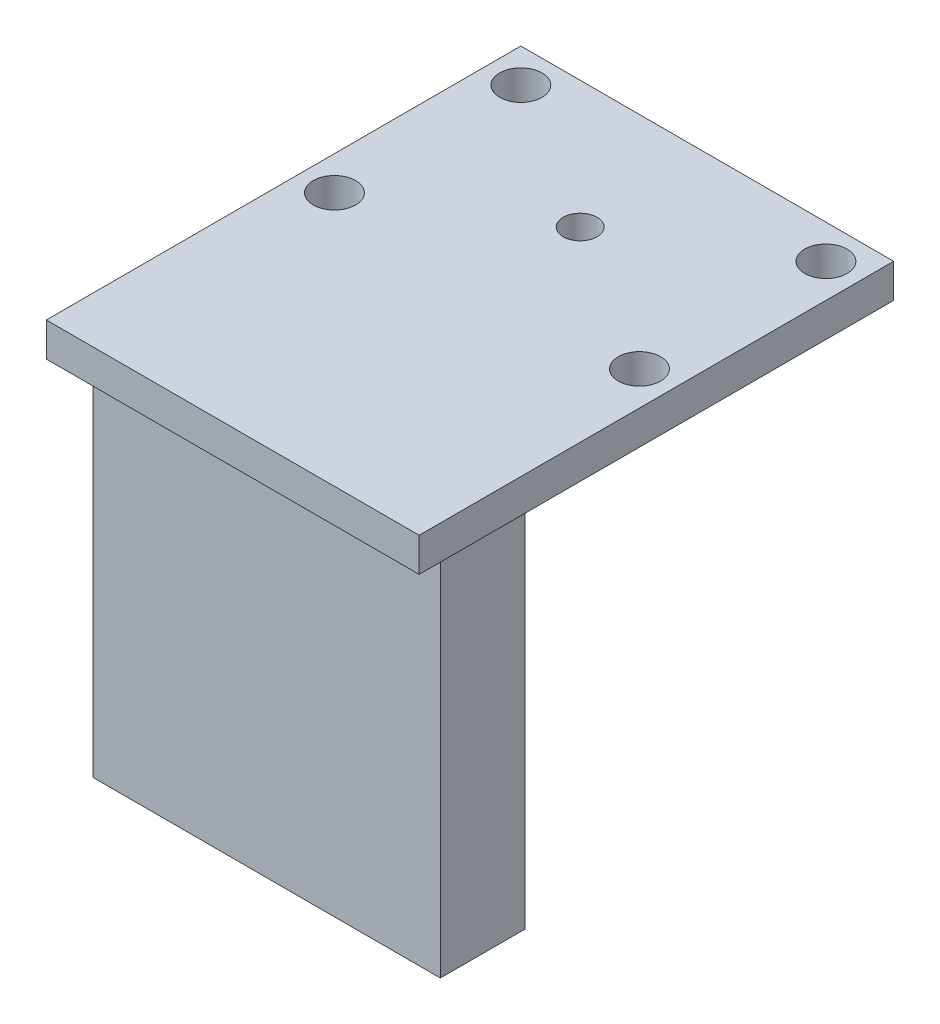
ISO-10303-21;
HEADER;
FILE_DESCRIPTION(('STEP AP214'),'2;1');
FILE_NAME('part.step','',(''),(''),'','','');
FILE_SCHEMA(('AUTOMOTIVE_DESIGN { 1 0 10303 214 1 1 1 1 }'));
ENDSEC;
DATA;
#1=APPLICATION_CONTEXT('core data for automotive mechanical design processes');
#2=APPLICATION_PROTOCOL_DEFINITION('international standard','automotive_design',2000,#1);
#3=PRODUCT_CONTEXT('',#1,'mechanical');
#4=PRODUCT('Part','Part','',(#3));
#5=PRODUCT_RELATED_PRODUCT_CATEGORY('part','',(#4));
#6=PRODUCT_DEFINITION_FORMATION('','',#4);
#7=PRODUCT_DEFINITION_CONTEXT('part definition',#1,'design');
#8=PRODUCT_DEFINITION('design','',#6,#7);
#9=PRODUCT_DEFINITION_SHAPE('','',#8);
#10=(LENGTH_UNIT() NAMED_UNIT(*) SI_UNIT(.MILLI.,.METRE.));
#11=(NAMED_UNIT(*) PLANE_ANGLE_UNIT() SI_UNIT($,.RADIAN.));
#12=(NAMED_UNIT(*) SI_UNIT($,.STERADIAN.) SOLID_ANGLE_UNIT());
#13=UNCERTAINTY_MEASURE_WITH_UNIT(LENGTH_MEASURE(1.E-05),#10,'distance_accuracy_value','');
#14=(GEOMETRIC_REPRESENTATION_CONTEXT(3) GLOBAL_UNCERTAINTY_ASSIGNED_CONTEXT((#13)) GLOBAL_UNIT_ASSIGNED_CONTEXT((#10,
#11,#12)) REPRESENTATION_CONTEXT('',''));
#15=CARTESIAN_POINT('',(0.,0.,0.));
#16=DIRECTION('',(0.,0.,1.));
#17=DIRECTION('',(1.,0.,0.));
#18=AXIS2_PLACEMENT_3D('',#15,#16,#17);
#19=CARTESIAN_POINT('',(0.,0.,0.));
#20=DIRECTION('',(0.,-1.,0.));
#21=DIRECTION('',(0.,0.,-1.));
#22=AXIS2_PLACEMENT_3D('',#19,#20,#21);
#23=PLANE('',#22);
#24=CARTESIAN_POINT('',(0.,0.,-6.5));
#25=DIRECTION('',(0.,-1.,0.));
#26=DIRECTION('',(0.,0.,-1.));
#27=AXIS2_PLACEMENT_3D('',#24,#25,#26);
#28=CIRCLE('',#27,1.);
#29=CARTESIAN_POINT('',(0.,0.,-7.5));
#30=VERTEX_POINT('',#29);
#31=EDGE_CURVE('E251',#30,#30,#28,.F.);
#32=ORIENTED_EDGE('',*,*,#31,.T.);
#33=EDGE_LOOP('',(#32));
#34=FACE_BOUND('',#33,.T.);
#35=CARTESIAN_POINT('',(-9.00000000000015,0.,-12.));
#36=DIRECTION('',(0.,-1.,0.));
#37=DIRECTION('',(0.,0.,-1.));
#38=AXIS2_PLACEMENT_3D('',#35,#36,#37);
#39=CIRCLE('',#38,1.25);
#40=CARTESIAN_POINT('',(-9.00000000000015,0.,-13.25));
#41=VERTEX_POINT('',#40);
#42=EDGE_CURVE('E151',#41,#41,#39,.F.);
#43=ORIENTED_EDGE('',*,*,#42,.T.);
#44=EDGE_LOOP('',(#43));
#45=FACE_BOUND('',#44,.T.);
#46=CARTESIAN_POINT('',(8.99999999999997,0.,-1.));
#47=DIRECTION('',(0.,-1.,0.));
#48=DIRECTION('',(0.,0.,-1.));
#49=AXIS2_PLACEMENT_3D('',#46,#47,#48);
#50=CIRCLE('',#49,1.25);
#51=CARTESIAN_POINT('',(8.99999999999997,0.,-2.25));
#52=VERTEX_POINT('',#51);
#53=EDGE_CURVE('E145',#52,#52,#50,.F.);
#54=ORIENTED_EDGE('',*,*,#53,.T.);
#55=EDGE_LOOP('',(#54));
#56=FACE_BOUND('',#55,.T.);
#57=CARTESIAN_POINT('',(-9.00000000000003,0.,-1.));
#58=DIRECTION('',(0.,-1.,0.));
#59=DIRECTION('',(0.,0.,-1.));
#60=AXIS2_PLACEMENT_3D('',#57,#58,#59);
#61=CIRCLE('',#60,1.25);
#62=CARTESIAN_POINT('',(-9.00000000000003,0.,-2.25));
#63=VERTEX_POINT('',#62);
#64=EDGE_CURVE('E136',#63,#63,#61,.F.);
#65=ORIENTED_EDGE('',*,*,#64,.T.);
#66=EDGE_LOOP('',(#65));
#67=FACE_BOUND('',#66,.T.);
#68=CARTESIAN_POINT('',(8.99999999999985,0.,-12.));
#69=DIRECTION('',(0.,-1.,0.));
#70=DIRECTION('',(0.,0.,-1.));
#71=AXIS2_PLACEMENT_3D('',#68,#69,#70);
#72=CIRCLE('',#71,1.25);
#73=CARTESIAN_POINT('',(8.99999999999985,0.,-13.25));
#74=VERTEX_POINT('',#73);
#75=EDGE_CURVE('E150',#74,#74,#72,.F.);
#76=ORIENTED_EDGE('',*,*,#75,.T.);
#77=EDGE_LOOP('',(#76));
#78=FACE_BOUND('',#77,.T.);
#79=DIRECTION('',(0.,0.,-1.));
#80=VECTOR('',#79,1.);
#81=CARTESIAN_POINT('',(11.,0.,14.));
#82=LINE('',#81,#80);
#83=CARTESIAN_POINT('',(11.,0.,14.));
#84=VERTEX_POINT('',#83);
#85=CARTESIAN_POINT('',(11.,0.,-14.));
#86=VERTEX_POINT('',#85);
#87=EDGE_CURVE('E162',#84,#86,#82,.T.);
#88=ORIENTED_EDGE('',*,*,#87,.F.);
#89=DIRECTION('',(1.,0.,0.));
#90=VECTOR('',#89,1.);
#91=CARTESIAN_POINT('',(-11.,0.,14.));
#92=LINE('',#91,#90);
#93=CARTESIAN_POINT('',(-11.,0.,14.));
#94=VERTEX_POINT('',#93);
#95=EDGE_CURVE('E82',#94,#84,#92,.T.);
#96=ORIENTED_EDGE('',*,*,#95,.F.);
#97=DIRECTION('',(0.,0.,1.));
#98=VECTOR('',#97,1.);
#99=CARTESIAN_POINT('',(-11.,0.,14.));
#100=LINE('',#99,#98);
#101=CARTESIAN_POINT('',(-11.,0.,-14.));
#102=VERTEX_POINT('',#101);
#103=EDGE_CURVE('E176',#102,#94,#100,.T.);
#104=ORIENTED_EDGE('',*,*,#103,.F.);
#105=DIRECTION('',(-1.,0.,0.));
#106=VECTOR('',#105,1.);
#107=CARTESIAN_POINT('',(-11.,0.,-14.));
#108=LINE('',#107,#106);
#109=EDGE_CURVE('E174',#86,#102,#108,.T.);
#110=ORIENTED_EDGE('',*,*,#109,.F.);
#111=EDGE_LOOP('',(#88,#96,#104,#110));
#112=FACE_BOUND('',#111,.T.);
#113=DIRECTION('',(-1.,0.,0.));
#114=VECTOR('',#113,1.);
#115=CARTESIAN_POINT('',(-10.25,0.,12.));
#116=LINE('',#115,#114);
#117=CARTESIAN_POINT('',(10.25,0.,12.));
#118=VERTEX_POINT('',#117);
#119=CARTESIAN_POINT('',(-10.25,0.,12.));
#120=VERTEX_POINT('',#119);
#121=EDGE_CURVE('E254',#118,#120,#116,.T.);
#122=ORIENTED_EDGE('',*,*,#121,.F.);
#123=DIRECTION('',(0.,0.,1.));
#124=VECTOR('',#123,1.);
#125=CARTESIAN_POINT('',(10.25,0.,7.));
#126=LINE('',#125,#124);
#127=CARTESIAN_POINT('',(10.25,0.,7.));
#128=VERTEX_POINT('',#127);
#129=EDGE_CURVE('E134',#128,#118,#126,.T.);
#130=ORIENTED_EDGE('',*,*,#129,.F.);
#131=DIRECTION('',(1.,0.,0.));
#132=VECTOR('',#131,1.);
#133=CARTESIAN_POINT('',(-10.25,0.,7.));
#134=LINE('',#133,#132);
#135=CARTESIAN_POINT('',(-10.25,0.,7.));
#136=VERTEX_POINT('',#135);
#137=EDGE_CURVE('E130',#136,#128,#134,.T.);
#138=ORIENTED_EDGE('',*,*,#137,.F.);
#139=DIRECTION('',(0.,0.,-1.));
#140=VECTOR('',#139,1.);
#141=CARTESIAN_POINT('',(-10.25,0.,7.));
#142=LINE('',#141,#140);
#143=EDGE_CURVE('E262',#120,#136,#142,.T.);
#144=ORIENTED_EDGE('',*,*,#143,.F.);
#145=EDGE_LOOP('',(#122,#130,#138,#144));
#146=FACE_BOUND('',#145,.T.);
#147=ADVANCED_FACE('F36',(#34,#45,#56,#67,#78,#112,#146),#23,.T.);
#148=CARTESIAN_POINT('',(11.,2.,14.));
#149=DIRECTION('',(-1.,0.,0.));
#150=DIRECTION('',(0.,0.,1.));
#151=AXIS2_PLACEMENT_3D('',#148,#149,#150);
#152=PLANE('',#151);
#153=ORIENTED_EDGE('',*,*,#87,.T.);
#154=DIRECTION('',(0.,-1.,0.));
#155=VECTOR('',#154,1.);
#156=CARTESIAN_POINT('',(11.,2.,-14.));
#157=LINE('',#156,#155);
#158=CARTESIAN_POINT('',(11.,2.,-14.));
#159=VERTEX_POINT('',#158);
#160=EDGE_CURVE('E11',#159,#86,#157,.T.);
#161=ORIENTED_EDGE('',*,*,#160,.F.);
#162=DIRECTION('',(0.,0.,-1.));
#163=VECTOR('',#162,1.);
#164=CARTESIAN_POINT('',(11.,2.,14.));
#165=LINE('',#164,#163);
#166=CARTESIAN_POINT('',(11.,2.,14.));
#167=VERTEX_POINT('',#166);
#168=EDGE_CURVE('E165',#167,#159,#165,.T.);
#169=ORIENTED_EDGE('',*,*,#168,.F.);
#170=DIRECTION('',(0.,-1.,0.));
#171=VECTOR('',#170,1.);
#172=CARTESIAN_POINT('',(11.,2.,14.));
#173=LINE('',#172,#171);
#174=EDGE_CURVE('E171',#167,#84,#173,.T.);
#175=ORIENTED_EDGE('',*,*,#174,.T.);
#176=EDGE_LOOP('',(#153,#161,#169,#175));
#177=FACE_BOUND('',#176,.T.);
#178=ADVANCED_FACE('F38',(#177),#152,.F.);
#179=CARTESIAN_POINT('',(-11.,2.,-14.));
#180=DIRECTION('',(0.,0.,1.));
#181=DIRECTION('',(1.,0.,0.));
#182=AXIS2_PLACEMENT_3D('',#179,#180,#181);
#183=PLANE('',#182);
#184=ORIENTED_EDGE('',*,*,#109,.T.);
#185=DIRECTION('',(0.,-1.,0.));
#186=VECTOR('',#185,1.);
#187=CARTESIAN_POINT('',(-11.,2.,-14.));
#188=LINE('',#187,#186);
#189=CARTESIAN_POINT('',(-11.,2.,-14.));
#190=VERTEX_POINT('',#189);
#191=EDGE_CURVE('E45',#190,#102,#188,.T.);
#192=ORIENTED_EDGE('',*,*,#191,.F.);
#193=DIRECTION('',(-1.,0.,0.));
#194=VECTOR('',#193,1.);
#195=CARTESIAN_POINT('',(-11.,2.,-14.));
#196=LINE('',#195,#194);
#197=EDGE_CURVE('E89',#159,#190,#196,.T.);
#198=ORIENTED_EDGE('',*,*,#197,.F.);
#199=ORIENTED_EDGE('',*,*,#160,.T.);
#200=EDGE_LOOP('',(#184,#192,#198,#199));
#201=FACE_BOUND('',#200,.T.);
#202=ADVANCED_FACE('F205',(#201),#183,.F.);
#203=CARTESIAN_POINT('',(-11.,2.,14.));
#204=DIRECTION('',(1.,0.,0.));
#205=DIRECTION('',(0.,0.,-1.));
#206=AXIS2_PLACEMENT_3D('',#203,#204,#205);
#207=PLANE('',#206);
#208=ORIENTED_EDGE('',*,*,#103,.T.);
#209=DIRECTION('',(0.,-1.,0.));
#210=VECTOR('',#209,1.);
#211=CARTESIAN_POINT('',(-11.,2.,14.));
#212=LINE('',#211,#210);
#213=CARTESIAN_POINT('',(-11.,2.,14.));
#214=VERTEX_POINT('',#213);
#215=EDGE_CURVE('E180',#214,#94,#212,.T.);
#216=ORIENTED_EDGE('',*,*,#215,.F.);
#217=DIRECTION('',(0.,0.,1.));
#218=VECTOR('',#217,1.);
#219=CARTESIAN_POINT('',(-11.,2.,14.));
#220=LINE('',#219,#218);
#221=EDGE_CURVE('E168',#190,#214,#220,.T.);
#222=ORIENTED_EDGE('',*,*,#221,.F.);
#223=ORIENTED_EDGE('',*,*,#191,.T.);
#224=EDGE_LOOP('',(#208,#216,#222,#223));
#225=FACE_BOUND('',#224,.T.);
#226=ADVANCED_FACE('F186',(#225),#207,.F.);
#227=CARTESIAN_POINT('',(-11.,2.,14.));
#228=DIRECTION('',(0.,0.,-1.));
#229=DIRECTION('',(-1.,0.,0.));
#230=AXIS2_PLACEMENT_3D('',#227,#228,#229);
#231=PLANE('',#230);
#232=ORIENTED_EDGE('',*,*,#95,.T.);
#233=ORIENTED_EDGE('',*,*,#174,.F.);
#234=DIRECTION('',(1.,0.,0.));
#235=VECTOR('',#234,1.);
#236=CARTESIAN_POINT('',(-11.,2.,14.));
#237=LINE('',#236,#235);
#238=EDGE_CURVE('E61',#214,#167,#237,.T.);
#239=ORIENTED_EDGE('',*,*,#238,.F.);
#240=ORIENTED_EDGE('',*,*,#215,.T.);
#241=EDGE_LOOP('',(#232,#233,#239,#240));
#242=FACE_BOUND('',#241,.T.);
#243=ADVANCED_FACE('F194',(#242),#231,.F.);
#244=CARTESIAN_POINT('',(0.,2.,0.));
#245=DIRECTION('',(0.,-1.,0.));
#246=DIRECTION('',(0.,0.,-1.));
#247=AXIS2_PLACEMENT_3D('',#244,#245,#246);
#248=PLANE('',#247);
#249=CARTESIAN_POINT('',(0.,2.,-6.5));
#250=DIRECTION('',(0.,-1.,0.));
#251=DIRECTION('',(0.,0.,-1.));
#252=AXIS2_PLACEMENT_3D('',#249,#250,#251);
#253=CIRCLE('',#252,1.);
#254=CARTESIAN_POINT('',(0.,2.,-7.5));
#255=VERTEX_POINT('',#254);
#256=EDGE_CURVE('E40',#255,#255,#253,.F.);
#257=ORIENTED_EDGE('',*,*,#256,.F.);
#258=EDGE_LOOP('',(#257));
#259=FACE_BOUND('',#258,.T.);
#260=CARTESIAN_POINT('',(-9.00000000000015,2.,-12.));
#261=DIRECTION('',(0.,1.,0.));
#262=DIRECTION('',(0.,0.,-1.));
#263=AXIS2_PLACEMENT_3D('',#260,#261,#262);
#264=CIRCLE('',#263,1.25);
#265=CARTESIAN_POINT('',(-9.00000000000015,2.,-13.25));
#266=VERTEX_POINT('',#265);
#267=EDGE_CURVE('E147',#266,#266,#264,.T.);
#268=ORIENTED_EDGE('',*,*,#267,.F.);
#269=EDGE_LOOP('',(#268));
#270=FACE_BOUND('',#269,.T.);
#271=CARTESIAN_POINT('',(8.99999999999997,2.,-1.));
#272=DIRECTION('',(0.,1.,0.));
#273=DIRECTION('',(0.,0.,1.));
#274=AXIS2_PLACEMENT_3D('',#271,#272,#273);
#275=CIRCLE('',#274,1.25);
#276=CARTESIAN_POINT('',(8.99999999999997,2.,0.249999999999995));
#277=VERTEX_POINT('',#276);
#278=EDGE_CURVE('E154',#277,#277,#275,.T.);
#279=ORIENTED_EDGE('',*,*,#278,.F.);
#280=EDGE_LOOP('',(#279));
#281=FACE_BOUND('',#280,.T.);
#282=CARTESIAN_POINT('',(-9.00000000000003,2.,-1.));
#283=DIRECTION('',(0.,1.,0.));
#284=DIRECTION('',(0.,0.,-1.));
#285=AXIS2_PLACEMENT_3D('',#282,#283,#284);
#286=CIRCLE('',#285,1.25);
#287=CARTESIAN_POINT('',(-9.00000000000003,2.,-2.25));
#288=VERTEX_POINT('',#287);
#289=EDGE_CURVE('E139',#288,#288,#286,.T.);
#290=ORIENTED_EDGE('',*,*,#289,.F.);
#291=EDGE_LOOP('',(#290));
#292=FACE_BOUND('',#291,.T.);
#293=CARTESIAN_POINT('',(8.99999999999985,2.,-12.));
#294=DIRECTION('',(0.,1.,0.));
#295=DIRECTION('',(0.,0.,1.));
#296=AXIS2_PLACEMENT_3D('',#293,#294,#295);
#297=CIRCLE('',#296,1.25);
#298=CARTESIAN_POINT('',(8.99999999999985,2.,-10.75));
#299=VERTEX_POINT('',#298);
#300=EDGE_CURVE('E159',#299,#299,#297,.T.);
#301=ORIENTED_EDGE('',*,*,#300,.F.);
#302=EDGE_LOOP('',(#301));
#303=FACE_BOUND('',#302,.T.);
#304=ORIENTED_EDGE('',*,*,#168,.T.);
#305=ORIENTED_EDGE('',*,*,#197,.T.);
#306=ORIENTED_EDGE('',*,*,#221,.T.);
#307=ORIENTED_EDGE('',*,*,#238,.T.);
#308=EDGE_LOOP('',(#304,#305,#306,#307));
#309=FACE_BOUND('',#308,.T.);
#310=ADVANCED_FACE('F196',(#259,#270,#281,#292,#303,#309),#248,.F.);
#311=CARTESIAN_POINT('',(8.99999999999985,-0.00100000000000013,-12.));
#312=DIRECTION('',(0.,1.,0.));
#313=DIRECTION('',(0.,0.,1.));
#314=AXIS2_PLACEMENT_3D('',#311,#312,#313);
#315=CYLINDRICAL_SURFACE('',#314,1.25);
#316=ORIENTED_EDGE('',*,*,#75,.F.);
#317=EDGE_LOOP('',(#316));
#318=FACE_BOUND('',#317,.T.);
#319=ORIENTED_EDGE('',*,*,#300,.T.);
#320=EDGE_LOOP('',(#319));
#321=FACE_BOUND('',#320,.T.);
#322=ADVANCED_FACE('F202',(#318,#321),#315,.F.);
#323=CARTESIAN_POINT('',(-9.00000000000003,-0.00100000000000013,-1.));
#324=DIRECTION('',(0.,1.,0.));
#325=DIRECTION('',(0.,0.,1.));
#326=AXIS2_PLACEMENT_3D('',#323,#324,#325);
#327=CYLINDRICAL_SURFACE('',#326,1.25);
#328=ORIENTED_EDGE('',*,*,#64,.F.);
#329=EDGE_LOOP('',(#328));
#330=FACE_BOUND('',#329,.T.);
#331=ORIENTED_EDGE('',*,*,#289,.T.);
#332=EDGE_LOOP('',(#331));
#333=FACE_BOUND('',#332,.T.);
#334=ADVANCED_FACE('F218',(#330,#333),#327,.F.);
#335=CARTESIAN_POINT('',(8.99999999999997,-0.00100000000000013,-1.));
#336=DIRECTION('',(0.,1.,0.));
#337=DIRECTION('',(0.,0.,1.));
#338=AXIS2_PLACEMENT_3D('',#335,#336,#337);
#339=CYLINDRICAL_SURFACE('',#338,1.25);
#340=ORIENTED_EDGE('',*,*,#53,.F.);
#341=EDGE_LOOP('',(#340));
#342=FACE_BOUND('',#341,.T.);
#343=ORIENTED_EDGE('',*,*,#278,.T.);
#344=EDGE_LOOP('',(#343));
#345=FACE_BOUND('',#344,.T.);
#346=ADVANCED_FACE('F220',(#342,#345),#339,.F.);
#347=CARTESIAN_POINT('',(-9.00000000000015,-0.00100000000000013,-12.));
#348=DIRECTION('',(0.,1.,0.));
#349=DIRECTION('',(0.,0.,1.));
#350=AXIS2_PLACEMENT_3D('',#347,#348,#349);
#351=CYLINDRICAL_SURFACE('',#350,1.25);
#352=ORIENTED_EDGE('',*,*,#42,.F.);
#353=EDGE_LOOP('',(#352));
#354=FACE_BOUND('',#353,.T.);
#355=ORIENTED_EDGE('',*,*,#267,.T.);
#356=EDGE_LOOP('',(#355));
#357=FACE_BOUND('',#356,.T.);
#358=ADVANCED_FACE('F223',(#354,#357),#351,.F.);
#359=CARTESIAN_POINT('',(10.25,-22.,7.));
#360=DIRECTION('',(-1.,0.,0.));
#361=DIRECTION('',(0.,0.,1.));
#362=AXIS2_PLACEMENT_3D('',#359,#360,#361);
#363=PLANE('',#362);
#364=ORIENTED_EDGE('',*,*,#129,.T.);
#365=DIRECTION('',(0.,1.,0.));
#366=VECTOR('',#365,1.);
#367=CARTESIAN_POINT('',(10.25,-22.,12.));
#368=LINE('',#367,#366);
#369=CARTESIAN_POINT('',(10.25,-22.,12.));
#370=VERTEX_POINT('',#369);
#371=EDGE_CURVE('E115',#370,#118,#368,.T.);
#372=ORIENTED_EDGE('',*,*,#371,.F.);
#373=DIRECTION('',(0.,0.,1.));
#374=VECTOR('',#373,1.);
#375=CARTESIAN_POINT('',(10.25,-22.,7.));
#376=LINE('',#375,#374);
#377=CARTESIAN_POINT('',(10.25,-22.,7.));
#378=VERTEX_POINT('',#377);
#379=EDGE_CURVE('E122',#378,#370,#376,.T.);
#380=ORIENTED_EDGE('',*,*,#379,.F.);
#381=DIRECTION('',(0.,1.,0.));
#382=VECTOR('',#381,1.);
#383=CARTESIAN_POINT('',(10.25,-22.,7.));
#384=LINE('',#383,#382);
#385=EDGE_CURVE('E259',#378,#128,#384,.T.);
#386=ORIENTED_EDGE('',*,*,#385,.T.);
#387=EDGE_LOOP('',(#364,#372,#380,#386));
#388=FACE_BOUND('',#387,.T.);
#389=ADVANCED_FACE('F132',(#388),#363,.F.);
#390=CARTESIAN_POINT('',(-10.25,-22.,12.));
#391=DIRECTION('',(0.,0.,-1.));
#392=DIRECTION('',(-1.,0.,0.));
#393=AXIS2_PLACEMENT_3D('',#390,#391,#392);
#394=PLANE('',#393);
#395=ORIENTED_EDGE('',*,*,#121,.T.);
#396=DIRECTION('',(0.,1.,0.));
#397=VECTOR('',#396,1.);
#398=CARTESIAN_POINT('',(-10.25,-22.,12.));
#399=LINE('',#398,#397);
#400=CARTESIAN_POINT('',(-10.25,-22.,12.));
#401=VERTEX_POINT('',#400);
#402=EDGE_CURVE('E118',#401,#120,#399,.T.);
#403=ORIENTED_EDGE('',*,*,#402,.F.);
#404=DIRECTION('',(-1.,0.,0.));
#405=VECTOR('',#404,1.);
#406=CARTESIAN_POINT('',(-10.25,-22.,12.));
#407=LINE('',#406,#405);
#408=EDGE_CURVE('E111',#370,#401,#407,.T.);
#409=ORIENTED_EDGE('',*,*,#408,.F.);
#410=ORIENTED_EDGE('',*,*,#371,.T.);
#411=EDGE_LOOP('',(#395,#403,#409,#410));
#412=FACE_BOUND('',#411,.T.);
#413=ADVANCED_FACE('F113',(#412),#394,.F.);
#414=CARTESIAN_POINT('',(-10.25,-22.,7.));
#415=DIRECTION('',(1.,0.,0.));
#416=DIRECTION('',(0.,0.,-1.));
#417=AXIS2_PLACEMENT_3D('',#414,#415,#416);
#418=PLANE('',#417);
#419=ORIENTED_EDGE('',*,*,#143,.T.);
#420=DIRECTION('',(0.,1.,0.));
#421=VECTOR('',#420,1.);
#422=CARTESIAN_POINT('',(-10.25,-22.,7.));
#423=LINE('',#422,#421);
#424=CARTESIAN_POINT('',(-10.25,-22.,7.));
#425=VERTEX_POINT('',#424);
#426=EDGE_CURVE('E52',#425,#136,#423,.T.);
#427=ORIENTED_EDGE('',*,*,#426,.F.);
#428=DIRECTION('',(0.,0.,-1.));
#429=VECTOR('',#428,1.);
#430=CARTESIAN_POINT('',(-10.25,-22.,7.));
#431=LINE('',#430,#429);
#432=EDGE_CURVE('E121',#401,#425,#431,.T.);
#433=ORIENTED_EDGE('',*,*,#432,.F.);
#434=ORIENTED_EDGE('',*,*,#402,.T.);
#435=EDGE_LOOP('',(#419,#427,#433,#434));
#436=FACE_BOUND('',#435,.T.);
#437=ADVANCED_FACE('F235',(#436),#418,.F.);
#438=CARTESIAN_POINT('',(-10.25,-22.,7.));
#439=DIRECTION('',(0.,0.,1.));
#440=DIRECTION('',(1.,0.,0.));
#441=AXIS2_PLACEMENT_3D('',#438,#439,#440);
#442=PLANE('',#441);
#443=ORIENTED_EDGE('',*,*,#137,.T.);
#444=ORIENTED_EDGE('',*,*,#385,.F.);
#445=DIRECTION('',(1.,0.,0.));
#446=VECTOR('',#445,1.);
#447=CARTESIAN_POINT('',(-10.25,-22.,7.));
#448=LINE('',#447,#446);
#449=EDGE_CURVE('E126',#425,#378,#448,.T.);
#450=ORIENTED_EDGE('',*,*,#449,.F.);
#451=ORIENTED_EDGE('',*,*,#426,.T.);
#452=EDGE_LOOP('',(#443,#444,#450,#451));
#453=FACE_BOUND('',#452,.T.);
#454=ADVANCED_FACE('F238',(#453),#442,.F.);
#455=CARTESIAN_POINT('',(0.,-22.,0.));
#456=DIRECTION('',(0.,1.,0.));
#457=DIRECTION('',(0.,0.,1.));
#458=AXIS2_PLACEMENT_3D('',#455,#456,#457);
#459=PLANE('',#458);
#460=ORIENTED_EDGE('',*,*,#379,.T.);
#461=ORIENTED_EDGE('',*,*,#408,.T.);
#462=ORIENTED_EDGE('',*,*,#432,.T.);
#463=ORIENTED_EDGE('',*,*,#449,.T.);
#464=EDGE_LOOP('',(#460,#461,#462,#463));
#465=FACE_BOUND('',#464,.T.);
#466=ADVANCED_FACE('F125',(#465),#459,.F.);
#467=CARTESIAN_POINT('',(0.,2.000012,-6.5));
#468=DIRECTION('',(0.,-1.,0.));
#469=DIRECTION('',(0.,0.,-1.));
#470=AXIS2_PLACEMENT_3D('',#467,#468,#469);
#471=CYLINDRICAL_SURFACE('',#470,1.);
#472=CARTESIAN_POINT('',(0.,0.,-7.5));
#473=CARTESIAN_POINT('',(0.,0.0208333333333333,-7.5));
#474=CARTESIAN_POINT('',(0.,0.0416666666666666,-7.5));
#475=CARTESIAN_POINT('',(0.,0.0833333333333332,-7.5));
#476=CARTESIAN_POINT('',(0.,0.104166666666667,-7.5));
#477=CARTESIAN_POINT('',(0.,0.145833333333333,-7.5));
#478=CARTESIAN_POINT('',(0.,0.166666666666667,-7.5));
#479=CARTESIAN_POINT('',(0.,0.208333333333333,-7.5));
#480=CARTESIAN_POINT('',(0.,0.229166666666667,-7.5));
#481=CARTESIAN_POINT('',(0.,0.270833333333333,-7.5));
#482=CARTESIAN_POINT('',(0.,0.291666666666667,-7.5));
#483=CARTESIAN_POINT('',(0.,0.333333333333333,-7.5));
#484=CARTESIAN_POINT('',(0.,0.354166666666667,-7.5));
#485=CARTESIAN_POINT('',(0.,0.395833333333333,-7.5));
#486=CARTESIAN_POINT('',(0.,0.416666666666667,-7.5));
#487=CARTESIAN_POINT('',(0.,0.458333333333333,-7.5));
#488=CARTESIAN_POINT('',(0.,0.479166666666667,-7.5));
#489=CARTESIAN_POINT('',(0.,0.520833333333333,-7.5));
#490=CARTESIAN_POINT('',(0.,0.541666666666667,-7.5));
#491=CARTESIAN_POINT('',(0.,0.583333333333333,-7.5));
#492=CARTESIAN_POINT('',(0.,0.604166666666667,-7.5));
#493=CARTESIAN_POINT('',(0.,0.645833333333333,-7.5));
#494=CARTESIAN_POINT('',(0.,0.666666666666667,-7.5));
#495=CARTESIAN_POINT('',(0.,0.708333333333333,-7.5));
#496=CARTESIAN_POINT('',(0.,0.729166666666667,-7.5));
#497=CARTESIAN_POINT('',(0.,0.770833333333333,-7.5));
#498=CARTESIAN_POINT('',(0.,0.791666666666667,-7.5));
#499=CARTESIAN_POINT('',(0.,0.833333333333333,-7.5));
#500=CARTESIAN_POINT('',(0.,0.854166666666667,-7.5));
#501=CARTESIAN_POINT('',(0.,0.895833333333333,-7.5));
#502=CARTESIAN_POINT('',(0.,0.916666666666667,-7.5));
#503=CARTESIAN_POINT('',(0.,0.958333333333333,-7.5));
#504=CARTESIAN_POINT('',(0.,0.979166666666667,-7.5));
#505=CARTESIAN_POINT('',(0.,1.02083333333333,-7.5));
#506=CARTESIAN_POINT('',(0.,1.04166666666667,-7.5));
#507=CARTESIAN_POINT('',(0.,1.08333333333333,-7.5));
#508=CARTESIAN_POINT('',(0.,1.10416666666667,-7.5));
#509=CARTESIAN_POINT('',(0.,1.14583333333333,-7.5));
#510=CARTESIAN_POINT('',(0.,1.16666666666667,-7.5));
#511=CARTESIAN_POINT('',(0.,1.20833333333333,-7.5));
#512=CARTESIAN_POINT('',(0.,1.22916666666667,-7.5));
#513=CARTESIAN_POINT('',(0.,1.27083333333333,-7.5));
#514=CARTESIAN_POINT('',(0.,1.29166666666667,-7.5));
#515=CARTESIAN_POINT('',(0.,1.33333333333333,-7.5));
#516=CARTESIAN_POINT('',(0.,1.35416666666667,-7.5));
#517=CARTESIAN_POINT('',(0.,1.39583333333333,-7.5));
#518=CARTESIAN_POINT('',(0.,1.41666666666667,-7.5));
#519=CARTESIAN_POINT('',(0.,1.45833333333333,-7.5));
#520=CARTESIAN_POINT('',(0.,1.47916666666667,-7.5));
#521=CARTESIAN_POINT('',(0.,1.52083333333333,-7.5));
#522=CARTESIAN_POINT('',(0.,1.54166666666667,-7.5));
#523=CARTESIAN_POINT('',(0.,1.58333333333333,-7.5));
#524=CARTESIAN_POINT('',(0.,1.60416666666667,-7.5));
#525=CARTESIAN_POINT('',(0.,1.64583333333333,-7.5));
#526=CARTESIAN_POINT('',(0.,1.66666666666667,-7.5));
#527=CARTESIAN_POINT('',(0.,1.70833333333333,-7.5));
#528=CARTESIAN_POINT('',(0.,1.72916666666667,-7.5));
#529=CARTESIAN_POINT('',(0.,1.77083333333333,-7.5));
#530=CARTESIAN_POINT('',(0.,1.79166666666667,-7.5));
#531=CARTESIAN_POINT('',(0.,1.83333333333333,-7.5));
#532=CARTESIAN_POINT('',(0.,1.85416666666667,-7.5));
#533=CARTESIAN_POINT('',(0.,1.89583333333333,-7.5));
#534=CARTESIAN_POINT('',(0.,1.91666666666667,-7.5));
#535=CARTESIAN_POINT('',(0.,1.95833333333333,-7.5));
#536=CARTESIAN_POINT('',(0.,1.97916666666667,-7.5));
#537=CARTESIAN_POINT('',(0.,2.,-7.5));
#538=B_SPLINE_CURVE_WITH_KNOTS('',3,(#472,#473,#474,#475,#476,#477,#478,#479,#480,#481,#482,
#483,#484,#485,#486,#487,#488,#489,#490,#491,#492,#493,#494,#495,#496,#497,#498,#499,#500,#501,
#502,#503,#504,#505,#506,#507,#508,#509,#510,#511,#512,#513,#514,#515,#516,#517,#518,#519,#520,
#521,#522,#523,#524,#525,#526,#527,#528,#529,#530,#531,#532,#533,#534,#535,#536,#537),
.UNSPECIFIED.,.F.,.F.,(4,2,2,2,2,2,2,2,2,2,2,2,2,2,2,2,2,2,2,2,2,2,2,2,2,2,2,2,2,2,2,2,4),(0.,
0.0624999999999998,0.125,0.1875,0.25,0.3125,0.375,0.4375,0.5,0.5625,0.625,0.6875,0.75,0.8125,
0.875,0.9375,1.,1.0625,1.125,1.1875,1.25,1.3125,1.375,1.4375,1.5,1.5625,1.625,1.6875,1.75,
1.8125,1.875,1.9375,2.),.UNSPECIFIED.);
#539=EDGE_CURVE('BSEAM244',#30,#255,#538,.T.);
#540=ORIENTED_EDGE('',*,*,#31,.F.);
#541=ORIENTED_EDGE('',*,*,#256,.T.);
#542=ORIENTED_EDGE('',*,*,#539,.T.);
#543=ORIENTED_EDGE('',*,*,#539,.F.);
#544=EDGE_LOOP('',(#540,#542,#541,#543));
#545=FACE_BOUND('',#544,.T.);
#546=ADVANCED_FACE('F244',(#545),#471,.F.);
#547=CLOSED_SHELL('',(#147,#178,#202,#226,#243,#310,#322,#334,#346,#358,#389,#413,#437,#454,
#466,#546));
#548=MANIFOLD_SOLID_BREP('B2',#547);
#549=ADVANCED_BREP_SHAPE_REPRESENTATION('',(#18,#548),#14);
#550=SHAPE_DEFINITION_REPRESENTATION(#9,#549);
ENDSEC;
END-ISO-10303-21;
